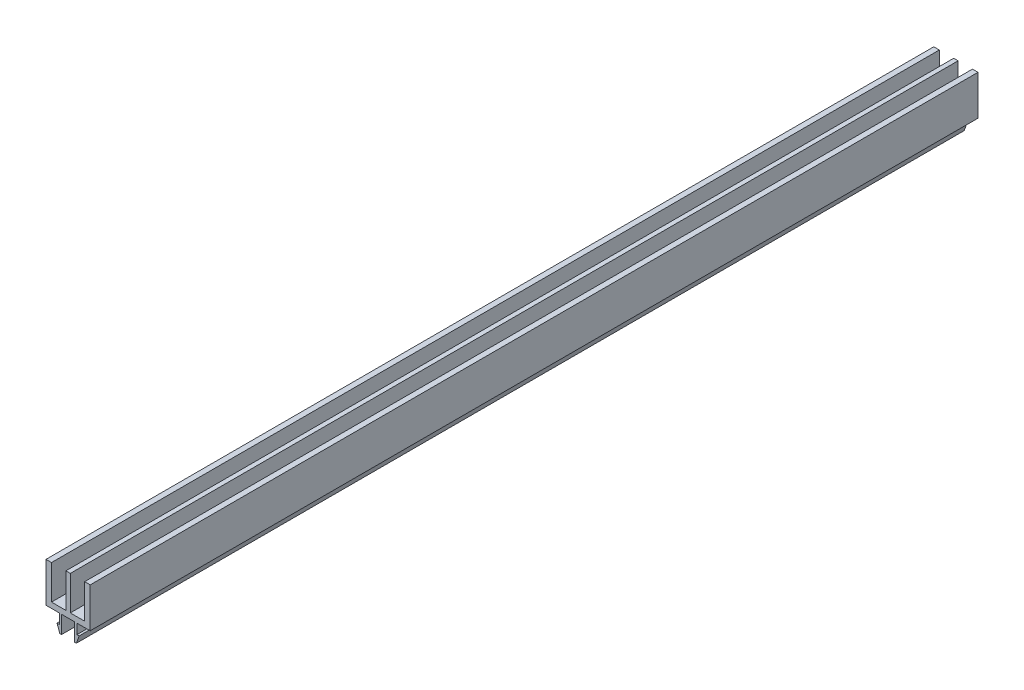
ISO-10303-21;
HEADER;
FILE_DESCRIPTION(('STEP AP214'),'2;1');
FILE_NAME('part.step','',(''),(''),'','','');
FILE_SCHEMA(('AUTOMOTIVE_DESIGN { 1 0 10303 214 1 1 1 1 }'));
ENDSEC;
DATA;
#1=APPLICATION_CONTEXT('core data for automotive mechanical design processes');
#2=APPLICATION_PROTOCOL_DEFINITION('international standard','automotive_design',2000,#1);
#3=PRODUCT_CONTEXT('',#1,'mechanical');
#4=PRODUCT('Part','Part','',(#3));
#5=PRODUCT_RELATED_PRODUCT_CATEGORY('part','',(#4));
#6=PRODUCT_DEFINITION_FORMATION('','',#4);
#7=PRODUCT_DEFINITION_CONTEXT('part definition',#1,'design');
#8=PRODUCT_DEFINITION('design','',#6,#7);
#9=PRODUCT_DEFINITION_SHAPE('','',#8);
#10=(LENGTH_UNIT() NAMED_UNIT(*) SI_UNIT(.MILLI.,.METRE.));
#11=(NAMED_UNIT(*) PLANE_ANGLE_UNIT() SI_UNIT($,.RADIAN.));
#12=(NAMED_UNIT(*) SI_UNIT($,.STERADIAN.) SOLID_ANGLE_UNIT());
#13=UNCERTAINTY_MEASURE_WITH_UNIT(LENGTH_MEASURE(1.E-05),#10,'distance_accuracy_value','');
#14=(GEOMETRIC_REPRESENTATION_CONTEXT(3) GLOBAL_UNCERTAINTY_ASSIGNED_CONTEXT((#13)) GLOBAL_UNIT_ASSIGNED_CONTEXT((#10,
#11,#12)) REPRESENTATION_CONTEXT('',''));
#15=CARTESIAN_POINT('',(0.,0.,0.));
#16=DIRECTION('',(0.,0.,1.));
#17=DIRECTION('',(1.,0.,0.));
#18=AXIS2_PLACEMENT_3D('',#15,#16,#17);
#19=CARTESIAN_POINT('',(-1.,17.9999999975,-351.71));
#20=DIRECTION('',(-1.,0.,0.));
#21=DIRECTION('',(0.,-1.,0.));
#22=AXIS2_PLACEMENT_3D('',#19,#20,#21);
#23=PLANE('',#22);
#24=DIRECTION('',(0.,-1.,0.));
#25=VECTOR('',#24,1.);
#26=CARTESIAN_POINT('',(-1.,17.9999999975,50.));
#27=LINE('',#26,#25);
#28=CARTESIAN_POINT('',(-1.,17.9999999975,50.));
#29=VERTEX_POINT('',#28);
#30=CARTESIAN_POINT('',(-1.,2.4999999995,50.));
#31=VERTEX_POINT('',#30);
#32=EDGE_CURVE('E225',#29,#31,#27,.T.);
#33=ORIENTED_EDGE('',*,*,#32,.F.);
#34=DIRECTION('',(0.,0.,1.));
#35=VECTOR('',#34,1.);
#36=CARTESIAN_POINT('',(-1.,17.9999999975,-351.71));
#37=LINE('',#36,#35);
#38=CARTESIAN_POINT('',(-1.,17.9999999975,-351.71));
#39=VERTEX_POINT('',#38);
#40=EDGE_CURVE('E11',#39,#29,#37,.T.);
#41=ORIENTED_EDGE('',*,*,#40,.F.);
#42=DIRECTION('',(0.,-1.,0.));
#43=VECTOR('',#42,1.);
#44=CARTESIAN_POINT('',(-1.,17.9999999975,-351.71));
#45=LINE('',#44,#43);
#46=CARTESIAN_POINT('',(-1.,2.4999999995,-351.71));
#47=VERTEX_POINT('',#46);
#48=EDGE_CURVE('E293',#39,#47,#45,.T.);
#49=ORIENTED_EDGE('',*,*,#48,.T.);
#50=DIRECTION('',(0.,0.,1.));
#51=VECTOR('',#50,1.);
#52=CARTESIAN_POINT('',(-1.,2.4999999995,-351.71));
#53=LINE('',#52,#51);
#54=EDGE_CURVE('E35',#47,#31,#53,.T.);
#55=ORIENTED_EDGE('',*,*,#54,.T.);
#56=EDGE_LOOP('',(#33,#41,#49,#55));
#57=FACE_BOUND('',#56,.T.);
#58=ADVANCED_FACE('F32',(#57),#23,.T.);
#59=CARTESIAN_POINT('',(0.999999999999998,17.9999999975,-351.71));
#60=DIRECTION('',(0.,1.,0.));
#61=DIRECTION('',(0.,0.,1.));
#62=AXIS2_PLACEMENT_3D('',#59,#60,#61);
#63=PLANE('',#62);
#64=DIRECTION('',(-1.,0.,0.));
#65=VECTOR('',#64,1.);
#66=CARTESIAN_POINT('',(0.999999999999998,17.9999999975,50.));
#67=LINE('',#66,#65);
#68=CARTESIAN_POINT('',(0.999999999999998,17.9999999975,50.));
#69=VERTEX_POINT('',#68);
#70=EDGE_CURVE('E291',#69,#29,#67,.T.);
#71=ORIENTED_EDGE('',*,*,#70,.F.);
#72=DIRECTION('',(0.,0.,1.));
#73=VECTOR('',#72,1.);
#74=CARTESIAN_POINT('',(0.999999999999998,17.9999999975,-351.71));
#75=LINE('',#74,#73);
#76=CARTESIAN_POINT('',(0.999999999999998,17.9999999975,-351.71));
#77=VERTEX_POINT('',#76);
#78=EDGE_CURVE('E41',#77,#69,#75,.T.);
#79=ORIENTED_EDGE('',*,*,#78,.F.);
#80=DIRECTION('',(-1.,0.,0.));
#81=VECTOR('',#80,1.);
#82=CARTESIAN_POINT('',(0.999999999999998,17.9999999975,-351.71));
#83=LINE('',#82,#81);
#84=EDGE_CURVE('E215',#77,#39,#83,.T.);
#85=ORIENTED_EDGE('',*,*,#84,.T.);
#86=ORIENTED_EDGE('',*,*,#40,.T.);
#87=EDGE_LOOP('',(#71,#79,#85,#86));
#88=FACE_BOUND('',#87,.T.);
#89=ADVANCED_FACE('F337',(#88),#63,.T.);
#90=CARTESIAN_POINT('',(0.999999999999998,2.4999999995,-351.71));
#91=DIRECTION('',(1.,0.,0.));
#92=DIRECTION('',(0.,0.,-1.));
#93=AXIS2_PLACEMENT_3D('',#90,#91,#92);
#94=PLANE('',#93);
#95=DIRECTION('',(0.,1.,0.));
#96=VECTOR('',#95,1.);
#97=CARTESIAN_POINT('',(0.999999999999998,2.4999999995,50.));
#98=LINE('',#97,#96);
#99=CARTESIAN_POINT('',(0.999999999999998,2.4999999995,50.));
#100=VERTEX_POINT('',#99);
#101=EDGE_CURVE('E202',#100,#69,#98,.T.);
#102=ORIENTED_EDGE('',*,*,#101,.F.);
#103=DIRECTION('',(0.,0.,1.));
#104=VECTOR('',#103,1.);
#105=CARTESIAN_POINT('',(0.999999999999998,2.4999999995,-351.71));
#106=LINE('',#105,#104);
#107=CARTESIAN_POINT('',(0.999999999999998,2.4999999995,-351.71));
#108=VERTEX_POINT('',#107);
#109=EDGE_CURVE('E197',#108,#100,#106,.T.);
#110=ORIENTED_EDGE('',*,*,#109,.F.);
#111=DIRECTION('',(0.,1.,0.));
#112=VECTOR('',#111,1.);
#113=CARTESIAN_POINT('',(0.999999999999998,2.4999999995,-351.71));
#114=LINE('',#113,#112);
#115=EDGE_CURVE('E200',#108,#77,#114,.T.);
#116=ORIENTED_EDGE('',*,*,#115,.T.);
#117=ORIENTED_EDGE('',*,*,#78,.T.);
#118=EDGE_LOOP('',(#102,#110,#116,#117));
#119=FACE_BOUND('',#118,.T.);
#120=ADVANCED_FACE('F199',(#119),#94,.T.);
#121=CARTESIAN_POINT('',(7.5,2.4999999995,-351.71));
#122=DIRECTION('',(0.,1.,0.));
#123=DIRECTION('',(-1.,0.,0.));
#124=AXIS2_PLACEMENT_3D('',#121,#122,#123);
#125=PLANE('',#124);
#126=DIRECTION('',(-1.,0.,0.));
#127=VECTOR('',#126,1.);
#128=CARTESIAN_POINT('',(7.5,2.4999999995,50.));
#129=LINE('',#128,#127);
#130=CARTESIAN_POINT('',(7.5,2.4999999995,50.));
#131=VERTEX_POINT('',#130);
#132=EDGE_CURVE('E288',#131,#100,#129,.T.);
#133=ORIENTED_EDGE('',*,*,#132,.F.);
#134=DIRECTION('',(0.,0.,1.));
#135=VECTOR('',#134,1.);
#136=CARTESIAN_POINT('',(7.5,2.4999999995,-351.71));
#137=LINE('',#136,#135);
#138=CARTESIAN_POINT('',(7.5,2.4999999995,-351.71));
#139=VERTEX_POINT('',#138);
#140=EDGE_CURVE('E207',#139,#131,#137,.T.);
#141=ORIENTED_EDGE('',*,*,#140,.F.);
#142=DIRECTION('',(-1.,0.,0.));
#143=VECTOR('',#142,1.);
#144=CARTESIAN_POINT('',(7.5,2.4999999995,-351.71));
#145=LINE('',#144,#143);
#146=EDGE_CURVE('E213',#139,#108,#145,.T.);
#147=ORIENTED_EDGE('',*,*,#146,.T.);
#148=ORIENTED_EDGE('',*,*,#109,.T.);
#149=EDGE_LOOP('',(#133,#141,#147,#148));
#150=FACE_BOUND('',#149,.T.);
#151=ADVANCED_FACE('F217',(#150),#125,.T.);
#152=CARTESIAN_POINT('',(7.5,17.9999999975,-351.71));
#153=DIRECTION('',(-1.,0.,0.));
#154=DIRECTION('',(0.,-1.,0.));
#155=AXIS2_PLACEMENT_3D('',#152,#153,#154);
#156=PLANE('',#155);
#157=DIRECTION('',(0.,-1.,0.));
#158=VECTOR('',#157,1.);
#159=CARTESIAN_POINT('',(7.5,17.9999999975,50.));
#160=LINE('',#159,#158);
#161=CARTESIAN_POINT('',(7.5,17.9999999975,50.));
#162=VERTEX_POINT('',#161);
#163=EDGE_CURVE('E285',#162,#131,#160,.T.);
#164=ORIENTED_EDGE('',*,*,#163,.F.);
#165=DIRECTION('',(0.,0.,1.));
#166=VECTOR('',#165,1.);
#167=CARTESIAN_POINT('',(7.5,17.9999999975,-351.71));
#168=LINE('',#167,#166);
#169=CARTESIAN_POINT('',(7.5,17.9999999975,-351.71));
#170=VERTEX_POINT('',#169);
#171=EDGE_CURVE('E297',#170,#162,#168,.T.);
#172=ORIENTED_EDGE('',*,*,#171,.F.);
#173=DIRECTION('',(0.,-1.,0.));
#174=VECTOR('',#173,1.);
#175=CARTESIAN_POINT('',(7.5,17.9999999975,-351.71));
#176=LINE('',#175,#174);
#177=EDGE_CURVE('E218',#170,#139,#176,.T.);
#178=ORIENTED_EDGE('',*,*,#177,.T.);
#179=ORIENTED_EDGE('',*,*,#140,.T.);
#180=EDGE_LOOP('',(#164,#172,#178,#179));
#181=FACE_BOUND('',#180,.T.);
#182=ADVANCED_FACE('F350',(#181),#156,.T.);
#183=CARTESIAN_POINT('',(10.,17.9999999975,-351.71));
#184=DIRECTION('',(0.,1.,0.));
#185=DIRECTION('',(0.,0.,1.));
#186=AXIS2_PLACEMENT_3D('',#183,#184,#185);
#187=PLANE('',#186);
#188=DIRECTION('',(-1.,0.,0.));
#189=VECTOR('',#188,1.);
#190=CARTESIAN_POINT('',(10.,17.9999999975,50.));
#191=LINE('',#190,#189);
#192=CARTESIAN_POINT('',(10.,17.9999999975,50.));
#193=VERTEX_POINT('',#192);
#194=EDGE_CURVE('E282',#193,#162,#191,.T.);
#195=ORIENTED_EDGE('',*,*,#194,.F.);
#196=DIRECTION('',(0.,0.,1.));
#197=VECTOR('',#196,1.);
#198=CARTESIAN_POINT('',(10.,17.9999999975,-351.71));
#199=LINE('',#198,#197);
#200=CARTESIAN_POINT('',(10.,17.9999999975,-351.71));
#201=VERTEX_POINT('',#200);
#202=EDGE_CURVE('E299',#201,#193,#199,.T.);
#203=ORIENTED_EDGE('',*,*,#202,.F.);
#204=DIRECTION('',(-1.,0.,0.));
#205=VECTOR('',#204,1.);
#206=CARTESIAN_POINT('',(10.,17.9999999975,-351.71));
#207=LINE('',#206,#205);
#208=EDGE_CURVE('E220',#201,#170,#207,.T.);
#209=ORIENTED_EDGE('',*,*,#208,.T.);
#210=ORIENTED_EDGE('',*,*,#171,.T.);
#211=EDGE_LOOP('',(#195,#203,#209,#210));
#212=FACE_BOUND('',#211,.T.);
#213=ADVANCED_FACE('F353',(#212),#187,.T.);
#214=CARTESIAN_POINT('',(10.,-4.99999828349541E-10,-351.71));
#215=DIRECTION('',(1.,0.,0.));
#216=DIRECTION('',(0.,0.,-1.));
#217=AXIS2_PLACEMENT_3D('',#214,#215,#216);
#218=PLANE('',#217);
#219=DIRECTION('',(0.,1.,0.));
#220=VECTOR('',#219,1.);
#221=CARTESIAN_POINT('',(10.,-4.99999828349541E-10,50.));
#222=LINE('',#221,#220);
#223=CARTESIAN_POINT('',(10.,-4.99999828349541E-10,50.));
#224=VERTEX_POINT('',#223);
#225=EDGE_CURVE('E279',#224,#193,#222,.T.);
#226=ORIENTED_EDGE('',*,*,#225,.F.);
#227=DIRECTION('',(0.,0.,1.));
#228=VECTOR('',#227,1.);
#229=CARTESIAN_POINT('',(10.,-4.99999828349541E-10,-351.71));
#230=LINE('',#229,#228);
#231=CARTESIAN_POINT('',(10.,-4.99999828349541E-10,-351.71));
#232=VERTEX_POINT('',#231);
#233=EDGE_CURVE('E301',#232,#224,#230,.T.);
#234=ORIENTED_EDGE('',*,*,#233,.F.);
#235=DIRECTION('',(0.,1.,0.));
#236=VECTOR('',#235,1.);
#237=CARTESIAN_POINT('',(10.,-4.99999828349541E-10,-351.71));
#238=LINE('',#237,#236);
#239=EDGE_CURVE('E643',#232,#201,#238,.T.);
#240=ORIENTED_EDGE('',*,*,#239,.T.);
#241=ORIENTED_EDGE('',*,*,#202,.T.);
#242=EDGE_LOOP('',(#226,#234,#240,#241));
#243=FACE_BOUND('',#242,.T.);
#244=ADVANCED_FACE('F357',(#243),#218,.T.);
#245=CARTESIAN_POINT('',(4.,-4.99999998002099E-10,-351.71));
#246=DIRECTION('',(0.,-1.,0.));
#247=DIRECTION('',(1.,0.,0.));
#248=AXIS2_PLACEMENT_3D('',#245,#246,#247);
#249=PLANE('',#248);
#250=DIRECTION('',(1.,0.,0.));
#251=VECTOR('',#250,1.);
#252=CARTESIAN_POINT('',(4.,-4.99999998002099E-10,50.));
#253=LINE('',#252,#251);
#254=CARTESIAN_POINT('',(4.,-4.99999998002099E-10,50.));
#255=VERTEX_POINT('',#254);
#256=EDGE_CURVE('E276',#255,#224,#253,.T.);
#257=ORIENTED_EDGE('',*,*,#256,.F.);
#258=DIRECTION('',(0.,0.,1.));
#259=VECTOR('',#258,1.);
#260=CARTESIAN_POINT('',(4.,-4.99999998002099E-10,-351.71));
#261=LINE('',#260,#259);
#262=CARTESIAN_POINT('',(4.,-4.99999998002099E-10,-351.71));
#263=VERTEX_POINT('',#262);
#264=EDGE_CURVE('E303',#263,#255,#261,.T.);
#265=ORIENTED_EDGE('',*,*,#264,.F.);
#266=DIRECTION('',(1.,0.,0.));
#267=VECTOR('',#266,1.);
#268=CARTESIAN_POINT('',(4.,-4.99999998002099E-10,-351.71));
#269=LINE('',#268,#267);
#270=EDGE_CURVE('E647',#263,#232,#269,.T.);
#271=ORIENTED_EDGE('',*,*,#270,.T.);
#272=ORIENTED_EDGE('',*,*,#233,.T.);
#273=EDGE_LOOP('',(#257,#265,#271,#272));
#274=FACE_BOUND('',#273,.T.);
#275=ADVANCED_FACE('F361',(#274),#249,.T.);
#276=CARTESIAN_POINT('',(4.,-4.5,-351.71));
#277=DIRECTION('',(1.,0.,0.));
#278=DIRECTION('',(0.,0.,-1.));
#279=AXIS2_PLACEMENT_3D('',#276,#277,#278);
#280=PLANE('',#279);
#281=DIRECTION('',(0.,1.,0.));
#282=VECTOR('',#281,1.);
#283=CARTESIAN_POINT('',(4.,-4.5,50.));
#284=LINE('',#283,#282);
#285=CARTESIAN_POINT('',(4.,-4.5,50.));
#286=VERTEX_POINT('',#285);
#287=EDGE_CURVE('E273',#286,#255,#284,.T.);
#288=ORIENTED_EDGE('',*,*,#287,.F.);
#289=DIRECTION('',(0.,0.,1.));
#290=VECTOR('',#289,1.);
#291=CARTESIAN_POINT('',(4.,-4.5,-351.71));
#292=LINE('',#291,#290);
#293=CARTESIAN_POINT('',(4.,-4.5,-351.71));
#294=VERTEX_POINT('',#293);
#295=EDGE_CURVE('E305',#294,#286,#292,.T.);
#296=ORIENTED_EDGE('',*,*,#295,.F.);
#297=DIRECTION('',(0.,1.,0.));
#298=VECTOR('',#297,1.);
#299=CARTESIAN_POINT('',(4.,-4.5,-351.71));
#300=LINE('',#299,#298);
#301=EDGE_CURVE('E636',#294,#263,#300,.T.);
#302=ORIENTED_EDGE('',*,*,#301,.T.);
#303=ORIENTED_EDGE('',*,*,#264,.T.);
#304=EDGE_LOOP('',(#288,#296,#302,#303));
#305=FACE_BOUND('',#304,.T.);
#306=ADVANCED_FACE('F365',(#305),#280,.T.);
#307=CARTESIAN_POINT('',(5.,-4.5,-351.71));
#308=DIRECTION('',(0.,1.,0.));
#309=DIRECTION('',(0.,0.,1.));
#310=AXIS2_PLACEMENT_3D('',#307,#308,#309);
#311=PLANE('',#310);
#312=DIRECTION('',(-1.,0.,0.));
#313=VECTOR('',#312,1.);
#314=CARTESIAN_POINT('',(5.,-4.5,50.));
#315=LINE('',#314,#313);
#316=CARTESIAN_POINT('',(5.,-4.5,50.));
#317=VERTEX_POINT('',#316);
#318=EDGE_CURVE('E270',#317,#286,#315,.T.);
#319=ORIENTED_EDGE('',*,*,#318,.F.);
#320=DIRECTION('',(0.,0.,1.));
#321=VECTOR('',#320,1.);
#322=CARTESIAN_POINT('',(5.,-4.5,-351.71));
#323=LINE('',#322,#321);
#324=CARTESIAN_POINT('',(5.,-4.5,-351.71));
#325=VERTEX_POINT('',#324);
#326=EDGE_CURVE('E307',#325,#317,#323,.T.);
#327=ORIENTED_EDGE('',*,*,#326,.F.);
#328=DIRECTION('',(-1.,0.,0.));
#329=VECTOR('',#328,1.);
#330=CARTESIAN_POINT('',(5.,-4.5,-351.71));
#331=LINE('',#330,#329);
#332=EDGE_CURVE('E632',#325,#294,#331,.T.);
#333=ORIENTED_EDGE('',*,*,#332,.T.);
#334=ORIENTED_EDGE('',*,*,#295,.T.);
#335=EDGE_LOOP('',(#319,#327,#333,#334));
#336=FACE_BOUND('',#335,.T.);
#337=ADVANCED_FACE('F369',(#336),#311,.T.);
#338=CARTESIAN_POINT('',(3.75,-8.,-351.71));
#339=DIRECTION('',(0.941741911594837,-0.336336396998156,0.));
#340=DIRECTION('',(0.336336396998157,0.941741911594838,0.));
#341=AXIS2_PLACEMENT_3D('',#338,#339,#340);
#342=PLANE('',#341);
#343=DIRECTION('',(0.336336396998157,0.941741911594837,0.));
#344=VECTOR('',#343,1.);
#345=CARTESIAN_POINT('',(3.75,-8.,50.));
#346=LINE('',#345,#344);
#347=CARTESIAN_POINT('',(3.75,-8.,50.));
#348=VERTEX_POINT('',#347);
#349=EDGE_CURVE('E267',#348,#317,#346,.T.);
#350=ORIENTED_EDGE('',*,*,#349,.F.);
#351=DIRECTION('',(0.,0.,1.));
#352=VECTOR('',#351,1.);
#353=CARTESIAN_POINT('',(3.75,-8.,-351.71));
#354=LINE('',#353,#352);
#355=CARTESIAN_POINT('',(3.75,-8.,-351.71));
#356=VERTEX_POINT('',#355);
#357=EDGE_CURVE('E309',#356,#348,#354,.T.);
#358=ORIENTED_EDGE('',*,*,#357,.F.);
#359=DIRECTION('',(0.336336396998157,0.941741911594837,0.));
#360=VECTOR('',#359,1.);
#361=CARTESIAN_POINT('',(3.75,-8.,-351.71));
#362=LINE('',#361,#360);
#363=EDGE_CURVE('E653',#356,#325,#362,.T.);
#364=ORIENTED_EDGE('',*,*,#363,.T.);
#365=ORIENTED_EDGE('',*,*,#326,.T.);
#366=EDGE_LOOP('',(#350,#358,#364,#365));
#367=FACE_BOUND('',#366,.T.);
#368=ADVANCED_FACE('F373',(#367),#342,.T.);
#369=CARTESIAN_POINT('',(3.,-8.,-351.71));
#370=DIRECTION('',(0.,-1.,0.));
#371=DIRECTION('',(0.,0.,-1.));
#372=AXIS2_PLACEMENT_3D('',#369,#370,#371);
#373=PLANE('',#372);
#374=DIRECTION('',(1.,0.,0.));
#375=VECTOR('',#374,1.);
#376=CARTESIAN_POINT('',(3.,-8.,50.));
#377=LINE('',#376,#375);
#378=CARTESIAN_POINT('',(3.,-8.,50.));
#379=VERTEX_POINT('',#378);
#380=EDGE_CURVE('E264',#379,#348,#377,.T.);
#381=ORIENTED_EDGE('',*,*,#380,.F.);
#382=DIRECTION('',(0.,0.,1.));
#383=VECTOR('',#382,1.);
#384=CARTESIAN_POINT('',(3.,-8.,-351.71));
#385=LINE('',#384,#383);
#386=CARTESIAN_POINT('',(3.,-8.,-351.71));
#387=VERTEX_POINT('',#386);
#388=EDGE_CURVE('E311',#387,#379,#385,.T.);
#389=ORIENTED_EDGE('',*,*,#388,.F.);
#390=DIRECTION('',(1.,0.,0.));
#391=VECTOR('',#390,1.);
#392=CARTESIAN_POINT('',(3.,-8.,-351.71));
#393=LINE('',#392,#391);
#394=EDGE_CURVE('E625',#387,#356,#393,.T.);
#395=ORIENTED_EDGE('',*,*,#394,.T.);
#396=ORIENTED_EDGE('',*,*,#357,.T.);
#397=EDGE_LOOP('',(#381,#389,#395,#396));
#398=FACE_BOUND('',#397,.T.);
#399=ADVANCED_FACE('F377',(#398),#373,.T.);
#400=CARTESIAN_POINT('',(3.,-4.9999985194348E-10,-351.71));
#401=DIRECTION('',(-1.,0.,0.));
#402=DIRECTION('',(0.,0.,1.));
#403=AXIS2_PLACEMENT_3D('',#400,#401,#402);
#404=PLANE('',#403);
#405=DIRECTION('',(0.,-1.,0.));
#406=VECTOR('',#405,1.);
#407=CARTESIAN_POINT('',(3.,-4.9999985194348E-10,50.));
#408=LINE('',#407,#406);
#409=CARTESIAN_POINT('',(3.,-4.9999985194348E-10,50.));
#410=VERTEX_POINT('',#409);
#411=EDGE_CURVE('E261',#410,#379,#408,.T.);
#412=ORIENTED_EDGE('',*,*,#411,.F.);
#413=DIRECTION('',(0.,0.,1.));
#414=VECTOR('',#413,1.);
#415=CARTESIAN_POINT('',(3.,-4.9999985194348E-10,-351.71));
#416=LINE('',#415,#414);
#417=CARTESIAN_POINT('',(3.,-4.9999985194348E-10,-351.71));
#418=VERTEX_POINT('',#417);
#419=EDGE_CURVE('E313',#418,#410,#416,.T.);
#420=ORIENTED_EDGE('',*,*,#419,.F.);
#421=DIRECTION('',(0.,-1.,0.));
#422=VECTOR('',#421,1.);
#423=CARTESIAN_POINT('',(3.,-4.9999985194348E-10,-351.71));
#424=LINE('',#423,#422);
#425=EDGE_CURVE('E621',#418,#387,#424,.T.);
#426=ORIENTED_EDGE('',*,*,#425,.T.);
#427=ORIENTED_EDGE('',*,*,#388,.T.);
#428=EDGE_LOOP('',(#412,#420,#426,#427));
#429=FACE_BOUND('',#428,.T.);
#430=ADVANCED_FACE('F381',(#429),#404,.T.);
#431=CARTESIAN_POINT('',(-3.,-4.99999455901012E-10,-351.71));
#432=DIRECTION('',(0.,-1.,0.));
#433=DIRECTION('',(1.,0.,0.));
#434=AXIS2_PLACEMENT_3D('',#431,#432,#433);
#435=PLANE('',#434);
#436=DIRECTION('',(1.,0.,0.));
#437=VECTOR('',#436,1.);
#438=CARTESIAN_POINT('',(-3.,-4.99999455901012E-10,50.));
#439=LINE('',#438,#437);
#440=CARTESIAN_POINT('',(-3.,-4.99999455901012E-10,50.));
#441=VERTEX_POINT('',#440);
#442=EDGE_CURVE('E258',#441,#410,#439,.T.);
#443=ORIENTED_EDGE('',*,*,#442,.F.);
#444=DIRECTION('',(0.,0.,1.));
#445=VECTOR('',#444,1.);
#446=CARTESIAN_POINT('',(-3.,-4.99999455901012E-10,-351.71));
#447=LINE('',#446,#445);
#448=CARTESIAN_POINT('',(-3.,-4.99999455901012E-10,-351.71));
#449=VERTEX_POINT('',#448);
#450=EDGE_CURVE('E315',#449,#441,#447,.T.);
#451=ORIENTED_EDGE('',*,*,#450,.F.);
#452=DIRECTION('',(1.,0.,0.));
#453=VECTOR('',#452,1.);
#454=CARTESIAN_POINT('',(-3.,-4.99999455901012E-10,-351.71));
#455=LINE('',#454,#453);
#456=EDGE_CURVE('E657',#449,#418,#455,.T.);
#457=ORIENTED_EDGE('',*,*,#456,.T.);
#458=ORIENTED_EDGE('',*,*,#419,.T.);
#459=EDGE_LOOP('',(#443,#451,#457,#458));
#460=FACE_BOUND('',#459,.T.);
#461=ADVANCED_FACE('F385',(#460),#435,.T.);
#462=CARTESIAN_POINT('',(-3.,-8.,-351.71));
#463=DIRECTION('',(1.,0.,0.));
#464=DIRECTION('',(0.,0.,-1.));
#465=AXIS2_PLACEMENT_3D('',#462,#463,#464);
#466=PLANE('',#465);
#467=DIRECTION('',(0.,1.,0.));
#468=VECTOR('',#467,1.);
#469=CARTESIAN_POINT('',(-3.,-8.,50.));
#470=LINE('',#469,#468);
#471=CARTESIAN_POINT('',(-3.,-8.,50.));
#472=VERTEX_POINT('',#471);
#473=EDGE_CURVE('E255',#472,#441,#470,.T.);
#474=ORIENTED_EDGE('',*,*,#473,.F.);
#475=DIRECTION('',(0.,0.,1.));
#476=VECTOR('',#475,1.);
#477=CARTESIAN_POINT('',(-3.,-8.,-351.71));
#478=LINE('',#477,#476);
#479=CARTESIAN_POINT('',(-3.,-8.,-351.71));
#480=VERTEX_POINT('',#479);
#481=EDGE_CURVE('E317',#480,#472,#478,.T.);
#482=ORIENTED_EDGE('',*,*,#481,.F.);
#483=DIRECTION('',(0.,1.,0.));
#484=VECTOR('',#483,1.);
#485=CARTESIAN_POINT('',(-3.,-8.,-351.71));
#486=LINE('',#485,#484);
#487=EDGE_CURVE('E614',#480,#449,#486,.T.);
#488=ORIENTED_EDGE('',*,*,#487,.T.);
#489=ORIENTED_EDGE('',*,*,#450,.T.);
#490=EDGE_LOOP('',(#474,#482,#488,#489));
#491=FACE_BOUND('',#490,.T.);
#492=ADVANCED_FACE('F389',(#491),#466,.T.);
#493=CARTESIAN_POINT('',(-3.75,-8.,-351.71));
#494=DIRECTION('',(0.,-1.,0.));
#495=DIRECTION('',(0.,0.,-1.));
#496=AXIS2_PLACEMENT_3D('',#493,#494,#495);
#497=PLANE('',#496);
#498=DIRECTION('',(1.,0.,0.));
#499=VECTOR('',#498,1.);
#500=CARTESIAN_POINT('',(-3.75,-8.,50.));
#501=LINE('',#500,#499);
#502=CARTESIAN_POINT('',(-3.75,-8.,50.));
#503=VERTEX_POINT('',#502);
#504=EDGE_CURVE('E252',#503,#472,#501,.T.);
#505=ORIENTED_EDGE('',*,*,#504,.F.);
#506=DIRECTION('',(0.,0.,1.));
#507=VECTOR('',#506,1.);
#508=CARTESIAN_POINT('',(-3.75,-8.,-351.71));
#509=LINE('',#508,#507);
#510=CARTESIAN_POINT('',(-3.75,-8.,-351.71));
#511=VERTEX_POINT('',#510);
#512=EDGE_CURVE('E319',#511,#503,#509,.T.);
#513=ORIENTED_EDGE('',*,*,#512,.F.);
#514=DIRECTION('',(1.,0.,0.));
#515=VECTOR('',#514,1.);
#516=CARTESIAN_POINT('',(-3.75,-8.,-351.71));
#517=LINE('',#516,#515);
#518=EDGE_CURVE('E610',#511,#480,#517,.T.);
#519=ORIENTED_EDGE('',*,*,#518,.T.);
#520=ORIENTED_EDGE('',*,*,#481,.T.);
#521=EDGE_LOOP('',(#505,#513,#519,#520));
#522=FACE_BOUND('',#521,.T.);
#523=ADVANCED_FACE('F393',(#522),#497,.T.);
#524=CARTESIAN_POINT('',(-5.,-4.5,-351.71));
#525=DIRECTION('',(-0.941741911594837,-0.336336396998156,0.));
#526=DIRECTION('',(0.336336396998156,-0.941741911594838,0.));
#527=AXIS2_PLACEMENT_3D('',#524,#525,#526);
#528=PLANE('',#527);
#529=DIRECTION('',(0.336336396998156,-0.941741911594837,0.));
#530=VECTOR('',#529,1.);
#531=CARTESIAN_POINT('',(-5.,-4.5,50.));
#532=LINE('',#531,#530);
#533=CARTESIAN_POINT('',(-5.,-4.5,50.));
#534=VERTEX_POINT('',#533);
#535=EDGE_CURVE('E249',#534,#503,#532,.T.);
#536=ORIENTED_EDGE('',*,*,#535,.F.);
#537=DIRECTION('',(0.,0.,1.));
#538=VECTOR('',#537,1.);
#539=CARTESIAN_POINT('',(-5.,-4.5,-351.71));
#540=LINE('',#539,#538);
#541=CARTESIAN_POINT('',(-5.,-4.5,-351.71));
#542=VERTEX_POINT('',#541);
#543=EDGE_CURVE('E321',#542,#534,#540,.T.);
#544=ORIENTED_EDGE('',*,*,#543,.F.);
#545=DIRECTION('',(0.336336396998156,-0.941741911594837,0.));
#546=VECTOR('',#545,1.);
#547=CARTESIAN_POINT('',(-5.,-4.5,-351.71));
#548=LINE('',#547,#546);
#549=EDGE_CURVE('E661',#542,#511,#548,.T.);
#550=ORIENTED_EDGE('',*,*,#549,.T.);
#551=ORIENTED_EDGE('',*,*,#512,.T.);
#552=EDGE_LOOP('',(#536,#544,#550,#551));
#553=FACE_BOUND('',#552,.T.);
#554=ADVANCED_FACE('F397',(#553),#528,.T.);
#555=CARTESIAN_POINT('',(-4.,-4.5,-351.71));
#556=DIRECTION('',(0.,1.,0.));
#557=DIRECTION('',(0.,0.,1.));
#558=AXIS2_PLACEMENT_3D('',#555,#556,#557);
#559=PLANE('',#558);
#560=DIRECTION('',(-1.,0.,0.));
#561=VECTOR('',#560,1.);
#562=CARTESIAN_POINT('',(-4.,-4.5,50.));
#563=LINE('',#562,#561);
#564=CARTESIAN_POINT('',(-4.,-4.5,50.));
#565=VERTEX_POINT('',#564);
#566=EDGE_CURVE('E246',#565,#534,#563,.T.);
#567=ORIENTED_EDGE('',*,*,#566,.F.);
#568=DIRECTION('',(0.,0.,1.));
#569=VECTOR('',#568,1.);
#570=CARTESIAN_POINT('',(-4.,-4.5,-351.71));
#571=LINE('',#570,#569);
#572=CARTESIAN_POINT('',(-4.,-4.5,-351.71));
#573=VERTEX_POINT('',#572);
#574=EDGE_CURVE('E323',#573,#565,#571,.T.);
#575=ORIENTED_EDGE('',*,*,#574,.F.);
#576=DIRECTION('',(-1.,0.,0.));
#577=VECTOR('',#576,1.);
#578=CARTESIAN_POINT('',(-4.,-4.5,-351.71));
#579=LINE('',#578,#577);
#580=EDGE_CURVE('E603',#573,#542,#579,.T.);
#581=ORIENTED_EDGE('',*,*,#580,.T.);
#582=ORIENTED_EDGE('',*,*,#543,.T.);
#583=EDGE_LOOP('',(#567,#575,#581,#582));
#584=FACE_BOUND('',#583,.T.);
#585=ADVANCED_FACE('F401',(#584),#559,.T.);
#586=CARTESIAN_POINT('',(-4.,-4.9999985194348E-10,-351.71));
#587=DIRECTION('',(-1.,0.,0.));
#588=DIRECTION('',(0.,0.,1.));
#589=AXIS2_PLACEMENT_3D('',#586,#587,#588);
#590=PLANE('',#589);
#591=DIRECTION('',(0.,-1.,0.));
#592=VECTOR('',#591,1.);
#593=CARTESIAN_POINT('',(-4.,-4.9999985194348E-10,50.));
#594=LINE('',#593,#592);
#595=CARTESIAN_POINT('',(-4.,-4.9999985194348E-10,50.));
#596=VERTEX_POINT('',#595);
#597=EDGE_CURVE('E243',#596,#565,#594,.T.);
#598=ORIENTED_EDGE('',*,*,#597,.F.);
#599=DIRECTION('',(0.,0.,1.));
#600=VECTOR('',#599,1.);
#601=CARTESIAN_POINT('',(-4.,-4.9999985194348E-10,-351.71));
#602=LINE('',#601,#600);
#603=CARTESIAN_POINT('',(-4.,-4.9999985194348E-10,-351.71));
#604=VERTEX_POINT('',#603);
#605=EDGE_CURVE('E325',#604,#596,#602,.T.);
#606=ORIENTED_EDGE('',*,*,#605,.F.);
#607=DIRECTION('',(0.,-1.,0.));
#608=VECTOR('',#607,1.);
#609=CARTESIAN_POINT('',(-4.,-4.9999985194348E-10,-351.71));
#610=LINE('',#609,#608);
#611=EDGE_CURVE('E599',#604,#573,#610,.T.);
#612=ORIENTED_EDGE('',*,*,#611,.T.);
#613=ORIENTED_EDGE('',*,*,#574,.T.);
#614=EDGE_LOOP('',(#598,#606,#612,#613));
#615=FACE_BOUND('',#614,.T.);
#616=ADVANCED_FACE('F405',(#615),#590,.T.);
#617=CARTESIAN_POINT('',(-10.,-4.99999719929324E-10,-351.71));
#618=DIRECTION('',(0.,-1.,0.));
#619=DIRECTION('',(1.,0.,0.));
#620=AXIS2_PLACEMENT_3D('',#617,#618,#619);
#621=PLANE('',#620);
#622=DIRECTION('',(1.,0.,0.));
#623=VECTOR('',#622,1.);
#624=CARTESIAN_POINT('',(-10.,-4.99999719929324E-10,50.));
#625=LINE('',#624,#623);
#626=CARTESIAN_POINT('',(-10.,-4.99999719929324E-10,50.));
#627=VERTEX_POINT('',#626);
#628=EDGE_CURVE('E240',#627,#596,#625,.T.);
#629=ORIENTED_EDGE('',*,*,#628,.F.);
#630=DIRECTION('',(0.,0.,1.));
#631=VECTOR('',#630,1.);
#632=CARTESIAN_POINT('',(-10.,-4.99999719929324E-10,-351.71));
#633=LINE('',#632,#631);
#634=CARTESIAN_POINT('',(-10.,-4.99999719929324E-10,-351.71));
#635=VERTEX_POINT('',#634);
#636=EDGE_CURVE('E327',#635,#627,#633,.T.);
#637=ORIENTED_EDGE('',*,*,#636,.F.);
#638=DIRECTION('',(1.,0.,0.));
#639=VECTOR('',#638,1.);
#640=CARTESIAN_POINT('',(-10.,-4.99999719929324E-10,-351.71));
#641=LINE('',#640,#639);
#642=EDGE_CURVE('E665',#635,#604,#641,.T.);
#643=ORIENTED_EDGE('',*,*,#642,.T.);
#644=ORIENTED_EDGE('',*,*,#605,.T.);
#645=EDGE_LOOP('',(#629,#637,#643,#644));
#646=FACE_BOUND('',#645,.T.);
#647=ADVANCED_FACE('F409',(#646),#621,.T.);
#648=CARTESIAN_POINT('',(-10.,17.9999999975,-351.71));
#649=DIRECTION('',(-1.,0.,0.));
#650=DIRECTION('',(0.,-1.,0.));
#651=AXIS2_PLACEMENT_3D('',#648,#649,#650);
#652=PLANE('',#651);
#653=DIRECTION('',(0.,-1.,0.));
#654=VECTOR('',#653,1.);
#655=CARTESIAN_POINT('',(-10.,17.9999999975,50.));
#656=LINE('',#655,#654);
#657=CARTESIAN_POINT('',(-10.,17.9999999975,50.));
#658=VERTEX_POINT('',#657);
#659=EDGE_CURVE('E237',#658,#627,#656,.T.);
#660=ORIENTED_EDGE('',*,*,#659,.F.);
#661=DIRECTION('',(0.,0.,1.));
#662=VECTOR('',#661,1.);
#663=CARTESIAN_POINT('',(-10.,17.9999999975,-351.71));
#664=LINE('',#663,#662);
#665=CARTESIAN_POINT('',(-10.,17.9999999975,-351.71));
#666=VERTEX_POINT('',#665);
#667=EDGE_CURVE('E329',#666,#658,#664,.T.);
#668=ORIENTED_EDGE('',*,*,#667,.F.);
#669=DIRECTION('',(0.,-1.,0.));
#670=VECTOR('',#669,1.);
#671=CARTESIAN_POINT('',(-10.,17.9999999975,-351.71));
#672=LINE('',#671,#670);
#673=EDGE_CURVE('E592',#666,#635,#672,.T.);
#674=ORIENTED_EDGE('',*,*,#673,.T.);
#675=ORIENTED_EDGE('',*,*,#636,.T.);
#676=EDGE_LOOP('',(#660,#668,#674,#675));
#677=FACE_BOUND('',#676,.T.);
#678=ADVANCED_FACE('F413',(#677),#652,.T.);
#679=CARTESIAN_POINT('',(-7.5,17.9999999975,-351.71));
#680=DIRECTION('',(0.,1.,0.));
#681=DIRECTION('',(0.,0.,1.));
#682=AXIS2_PLACEMENT_3D('',#679,#680,#681);
#683=PLANE('',#682);
#684=DIRECTION('',(-1.,0.,0.));
#685=VECTOR('',#684,1.);
#686=CARTESIAN_POINT('',(-7.5,17.9999999975,50.));
#687=LINE('',#686,#685);
#688=CARTESIAN_POINT('',(-7.5,17.9999999975,50.));
#689=VERTEX_POINT('',#688);
#690=EDGE_CURVE('E234',#689,#658,#687,.T.);
#691=ORIENTED_EDGE('',*,*,#690,.F.);
#692=DIRECTION('',(0.,0.,1.));
#693=VECTOR('',#692,1.);
#694=CARTESIAN_POINT('',(-7.5,17.9999999975,-351.71));
#695=LINE('',#694,#693);
#696=CARTESIAN_POINT('',(-7.5,17.9999999975,-351.71));
#697=VERTEX_POINT('',#696);
#698=EDGE_CURVE('E331',#697,#689,#695,.T.);
#699=ORIENTED_EDGE('',*,*,#698,.F.);
#700=DIRECTION('',(-1.,0.,0.));
#701=VECTOR('',#700,1.);
#702=CARTESIAN_POINT('',(-7.5,17.9999999975,-351.71));
#703=LINE('',#702,#701);
#704=EDGE_CURVE('E588',#697,#666,#703,.T.);
#705=ORIENTED_EDGE('',*,*,#704,.T.);
#706=ORIENTED_EDGE('',*,*,#667,.T.);
#707=EDGE_LOOP('',(#691,#699,#705,#706));
#708=FACE_BOUND('',#707,.T.);
#709=ADVANCED_FACE('F417',(#708),#683,.T.);
#710=CARTESIAN_POINT('',(-7.5,2.4999999995,-351.71));
#711=DIRECTION('',(1.,0.,0.));
#712=DIRECTION('',(0.,0.,-1.));
#713=AXIS2_PLACEMENT_3D('',#710,#711,#712);
#714=PLANE('',#713);
#715=DIRECTION('',(0.,1.,0.));
#716=VECTOR('',#715,1.);
#717=CARTESIAN_POINT('',(-7.5,2.4999999995,50.));
#718=LINE('',#717,#716);
#719=CARTESIAN_POINT('',(-7.5,2.4999999995,50.));
#720=VERTEX_POINT('',#719);
#721=EDGE_CURVE('E231',#720,#689,#718,.T.);
#722=ORIENTED_EDGE('',*,*,#721,.F.);
#723=DIRECTION('',(0.,0.,1.));
#724=VECTOR('',#723,1.);
#725=CARTESIAN_POINT('',(-7.5,2.4999999995,-351.71));
#726=LINE('',#725,#724);
#727=CARTESIAN_POINT('',(-7.5,2.4999999995,-351.71));
#728=VERTEX_POINT('',#727);
#729=EDGE_CURVE('E332',#728,#720,#726,.T.);
#730=ORIENTED_EDGE('',*,*,#729,.F.);
#731=DIRECTION('',(0.,1.,0.));
#732=VECTOR('',#731,1.);
#733=CARTESIAN_POINT('',(-7.5,2.4999999995,-351.71));
#734=LINE('',#733,#732);
#735=EDGE_CURVE('E669',#728,#697,#734,.T.);
#736=ORIENTED_EDGE('',*,*,#735,.T.);
#737=ORIENTED_EDGE('',*,*,#698,.T.);
#738=EDGE_LOOP('',(#722,#730,#736,#737));
#739=FACE_BOUND('',#738,.T.);
#740=ADVANCED_FACE('F421',(#739),#714,.T.);
#741=CARTESIAN_POINT('',(-1.,2.4999999995,-351.71));
#742=DIRECTION('',(0.,1.,0.));
#743=DIRECTION('',(-1.,0.,0.));
#744=AXIS2_PLACEMENT_3D('',#741,#742,#743);
#745=PLANE('',#744);
#746=DIRECTION('',(-1.,0.,0.));
#747=VECTOR('',#746,1.);
#748=CARTESIAN_POINT('',(-1.,2.4999999995,50.));
#749=LINE('',#748,#747);
#750=EDGE_CURVE('E228',#31,#720,#749,.T.);
#751=ORIENTED_EDGE('',*,*,#750,.F.);
#752=ORIENTED_EDGE('',*,*,#54,.F.);
#753=DIRECTION('',(-1.,0.,0.));
#754=VECTOR('',#753,1.);
#755=CARTESIAN_POINT('',(-1.,2.4999999995,-351.71));
#756=LINE('',#755,#754);
#757=EDGE_CURVE('E671',#47,#728,#756,.T.);
#758=ORIENTED_EDGE('',*,*,#757,.T.);
#759=ORIENTED_EDGE('',*,*,#729,.T.);
#760=EDGE_LOOP('',(#751,#752,#758,#759));
#761=FACE_BOUND('',#760,.T.);
#762=ADVANCED_FACE('F334',(#761),#745,.T.);
#763=CARTESIAN_POINT('',(0.,0.,-351.71));
#764=DIRECTION('',(0.,0.,-1.));
#765=DIRECTION('',(-1.,0.,0.));
#766=AXIS2_PLACEMENT_3D('',#763,#764,#765);
#767=PLANE('',#766);
#768=ORIENTED_EDGE('',*,*,#48,.F.);
#769=ORIENTED_EDGE('',*,*,#84,.F.);
#770=ORIENTED_EDGE('',*,*,#115,.F.);
#771=ORIENTED_EDGE('',*,*,#146,.F.);
#772=ORIENTED_EDGE('',*,*,#177,.F.);
#773=ORIENTED_EDGE('',*,*,#208,.F.);
#774=ORIENTED_EDGE('',*,*,#239,.F.);
#775=ORIENTED_EDGE('',*,*,#270,.F.);
#776=ORIENTED_EDGE('',*,*,#301,.F.);
#777=ORIENTED_EDGE('',*,*,#332,.F.);
#778=ORIENTED_EDGE('',*,*,#363,.F.);
#779=ORIENTED_EDGE('',*,*,#394,.F.);
#780=ORIENTED_EDGE('',*,*,#425,.F.);
#781=ORIENTED_EDGE('',*,*,#456,.F.);
#782=ORIENTED_EDGE('',*,*,#487,.F.);
#783=ORIENTED_EDGE('',*,*,#518,.F.);
#784=ORIENTED_EDGE('',*,*,#549,.F.);
#785=ORIENTED_EDGE('',*,*,#580,.F.);
#786=ORIENTED_EDGE('',*,*,#611,.F.);
#787=ORIENTED_EDGE('',*,*,#642,.F.);
#788=ORIENTED_EDGE('',*,*,#673,.F.);
#789=ORIENTED_EDGE('',*,*,#704,.F.);
#790=ORIENTED_EDGE('',*,*,#735,.F.);
#791=ORIENTED_EDGE('',*,*,#757,.F.);
#792=EDGE_LOOP('',(#768,#769,#770,#771,#772,#773,#774,#775,#776,#777,#778,#779,#780,#781,#782,
#783,#784,#785,#786,#787,#788,#789,#790,#791));
#793=FACE_BOUND('',#792,.T.);
#794=ADVANCED_FACE('F211',(#793),#767,.T.);
#795=CARTESIAN_POINT('',(0.,0.,50.));
#796=DIRECTION('',(0.,0.,-1.));
#797=DIRECTION('',(-1.,0.,0.));
#798=AXIS2_PLACEMENT_3D('',#795,#796,#797);
#799=PLANE('',#798);
#800=ORIENTED_EDGE('',*,*,#32,.T.);
#801=ORIENTED_EDGE('',*,*,#750,.T.);
#802=ORIENTED_EDGE('',*,*,#721,.T.);
#803=ORIENTED_EDGE('',*,*,#690,.T.);
#804=ORIENTED_EDGE('',*,*,#659,.T.);
#805=ORIENTED_EDGE('',*,*,#628,.T.);
#806=ORIENTED_EDGE('',*,*,#597,.T.);
#807=ORIENTED_EDGE('',*,*,#566,.T.);
#808=ORIENTED_EDGE('',*,*,#535,.T.);
#809=ORIENTED_EDGE('',*,*,#504,.T.);
#810=ORIENTED_EDGE('',*,*,#473,.T.);
#811=ORIENTED_EDGE('',*,*,#442,.T.);
#812=ORIENTED_EDGE('',*,*,#411,.T.);
#813=ORIENTED_EDGE('',*,*,#380,.T.);
#814=ORIENTED_EDGE('',*,*,#349,.T.);
#815=ORIENTED_EDGE('',*,*,#318,.T.);
#816=ORIENTED_EDGE('',*,*,#287,.T.);
#817=ORIENTED_EDGE('',*,*,#256,.T.);
#818=ORIENTED_EDGE('',*,*,#225,.T.);
#819=ORIENTED_EDGE('',*,*,#194,.T.);
#820=ORIENTED_EDGE('',*,*,#163,.T.);
#821=ORIENTED_EDGE('',*,*,#132,.T.);
#822=ORIENTED_EDGE('',*,*,#101,.T.);
#823=ORIENTED_EDGE('',*,*,#70,.T.);
#824=EDGE_LOOP('',(#800,#801,#802,#803,#804,#805,#806,#807,#808,#809,#810,#811,#812,#813,#814,
#815,#816,#817,#818,#819,#820,#821,#822,#823));
#825=FACE_BOUND('',#824,.T.);
#826=ADVANCED_FACE('F336',(#825),#799,.F.);
#827=CLOSED_SHELL('',(#58,#89,#120,#151,#182,#213,#244,#275,#306,#337,#368,#399,#430,#461,#492,
#523,#554,#585,#616,#647,#678,#709,#740,#762,#794,#826));
#828=MANIFOLD_SOLID_BREP('B2',#827);
#829=ADVANCED_BREP_SHAPE_REPRESENTATION('',(#18,#828),#14);
#830=SHAPE_DEFINITION_REPRESENTATION(#9,#829);
ENDSEC;
END-ISO-10303-21;
